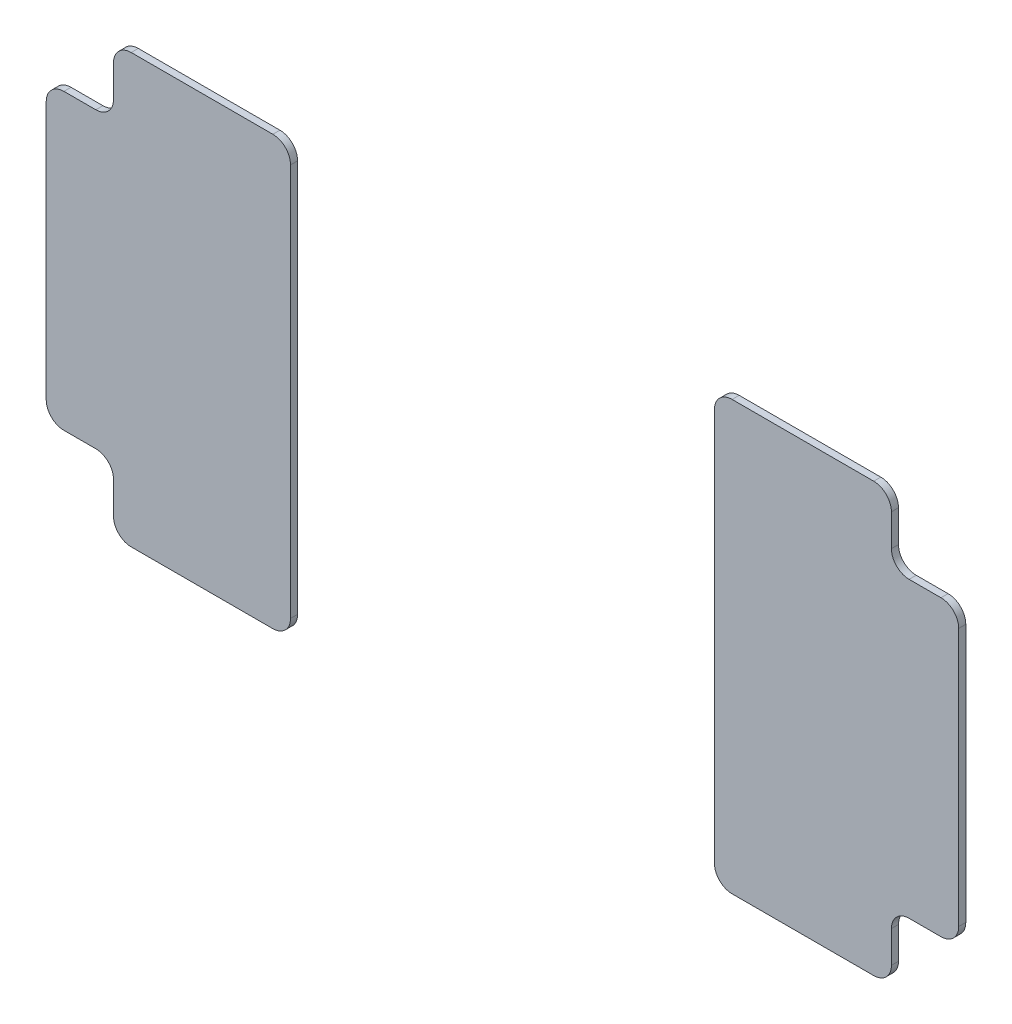
ISO-10303-21;
HEADER;
FILE_DESCRIPTION(('STEP AP214'),'2;1');
FILE_NAME('part.step','',(''),(''),'','','');
FILE_SCHEMA(('AUTOMOTIVE_DESIGN { 1 0 10303 214 1 1 1 1 }'));
ENDSEC;
DATA;
#1=APPLICATION_CONTEXT('core data for automotive mechanical design processes');
#2=APPLICATION_PROTOCOL_DEFINITION('international standard','automotive_design',2000,#1);
#3=PRODUCT_CONTEXT('',#1,'mechanical');
#4=PRODUCT('Part','Part','',(#3));
#5=PRODUCT_RELATED_PRODUCT_CATEGORY('part','',(#4));
#6=PRODUCT_DEFINITION_FORMATION('','',#4);
#7=PRODUCT_DEFINITION_CONTEXT('part definition',#1,'design');
#8=PRODUCT_DEFINITION('design','',#6,#7);
#9=PRODUCT_DEFINITION_SHAPE('','',#8);
#10=(LENGTH_UNIT() NAMED_UNIT(*) SI_UNIT(.MILLI.,.METRE.));
#11=(NAMED_UNIT(*) PLANE_ANGLE_UNIT() SI_UNIT($,.RADIAN.));
#12=(NAMED_UNIT(*) SI_UNIT($,.STERADIAN.) SOLID_ANGLE_UNIT());
#13=UNCERTAINTY_MEASURE_WITH_UNIT(LENGTH_MEASURE(1.E-05),#10,'distance_accuracy_value','');
#14=(GEOMETRIC_REPRESENTATION_CONTEXT(3) GLOBAL_UNCERTAINTY_ASSIGNED_CONTEXT((#13)) GLOBAL_UNIT_ASSIGNED_CONTEXT((#10,
#11,#12)) REPRESENTATION_CONTEXT('',''));
#15=CARTESIAN_POINT('',(0.,0.,0.));
#16=DIRECTION('',(0.,0.,1.));
#17=DIRECTION('',(1.,0.,0.));
#18=AXIS2_PLACEMENT_3D('',#15,#16,#17);
#19=CARTESIAN_POINT('',(0.,10.286374555593,-2.));
#20=DIRECTION('',(0.,-1.,0.));
#21=DIRECTION('',(0.,0.,-1.));
#22=AXIS2_PLACEMENT_3D('',#19,#20,#21);
#23=PLANE('',#22);
#24=DIRECTION('',(1.,0.,0.));
#25=VECTOR('',#24,1.);
#26=CARTESIAN_POINT('',(0.,10.286374555593,-2.));
#27=LINE('',#26,#25);
#28=CARTESIAN_POINT('',(205.158478801983,10.286374555593,-2.));
#29=VERTEX_POINT('',#28);
#30=CARTESIAN_POINT('',(245.158478801983,10.286374555593,-2.));
#31=VERTEX_POINT('',#30);
#32=EDGE_CURVE('E191',#29,#31,#27,.T.);
#33=ORIENTED_EDGE('',*,*,#32,.T.);
#34=DIRECTION('',(0.,0.,1.));
#35=VECTOR('',#34,1.);
#36=CARTESIAN_POINT('',(245.158478801983,10.286374555593,-2.));
#37=LINE('',#36,#35);
#38=CARTESIAN_POINT('',(245.158478801983,10.286374555593,0.));
#39=VERTEX_POINT('',#38);
#40=EDGE_CURVE('E250',#31,#39,#37,.T.);
#41=ORIENTED_EDGE('',*,*,#40,.T.);
#42=DIRECTION('',(1.,0.,0.));
#43=VECTOR('',#42,1.);
#44=CARTESIAN_POINT('',(0.,10.286374555593,0.));
#45=LINE('',#44,#43);
#46=CARTESIAN_POINT('',(205.158478801983,10.286374555593,0.));
#47=VERTEX_POINT('',#46);
#48=EDGE_CURVE('E295',#47,#39,#45,.T.);
#49=ORIENTED_EDGE('',*,*,#48,.F.);
#50=DIRECTION('',(0.,0.,1.));
#51=VECTOR('',#50,1.);
#52=CARTESIAN_POINT('',(205.158478801983,10.286374555593,-2.));
#53=LINE('',#52,#51);
#54=EDGE_CURVE('E248',#47,#29,#53,.F.);
#55=ORIENTED_EDGE('',*,*,#54,.T.);
#56=EDGE_LOOP('',(#33,#41,#49,#55));
#57=FACE_BOUND('',#56,.T.);
#58=ADVANCED_FACE('F49',(#57),#23,.T.);
#59=CARTESIAN_POINT('',(200.158478801983,0.,-2.));
#60=DIRECTION('',(1.,0.,0.));
#61=DIRECTION('',(0.,0.,-1.));
#62=AXIS2_PLACEMENT_3D('',#59,#60,#61);
#63=PLANE('',#62);
#64=DIRECTION('',(0.,1.,0.));
#65=VECTOR('',#64,1.);
#66=CARTESIAN_POINT('',(200.158478801983,0.,0.));
#67=LINE('',#66,#65);
#68=CARTESIAN_POINT('',(200.158478801983,15.286374555593,0.));
#69=VERTEX_POINT('',#68);
#70=CARTESIAN_POINT('',(200.158478801983,126.238694525702,0.));
#71=VERTEX_POINT('',#70);
#72=EDGE_CURVE('E188',#69,#71,#67,.T.);
#73=ORIENTED_EDGE('',*,*,#72,.T.);
#74=DIRECTION('',(0.,0.,1.));
#75=VECTOR('',#74,1.);
#76=CARTESIAN_POINT('',(200.158478801983,126.238694525702,-2.));
#77=LINE('',#76,#75);
#78=CARTESIAN_POINT('',(200.158478801983,126.238694525702,-2.));
#79=VERTEX_POINT('',#78);
#80=EDGE_CURVE('E167',#71,#79,#77,.F.);
#81=ORIENTED_EDGE('',*,*,#80,.T.);
#82=DIRECTION('',(0.,1.,0.));
#83=VECTOR('',#82,1.);
#84=CARTESIAN_POINT('',(200.158478801983,0.,-2.));
#85=LINE('',#84,#83);
#86=CARTESIAN_POINT('',(200.158478801983,15.286374555593,-2.));
#87=VERTEX_POINT('',#86);
#88=EDGE_CURVE('E199',#87,#79,#85,.T.);
#89=ORIENTED_EDGE('',*,*,#88,.F.);
#90=DIRECTION('',(0.,0.,1.));
#91=VECTOR('',#90,1.);
#92=CARTESIAN_POINT('',(200.158478801983,15.286374555593,0.));
#93=LINE('',#92,#91);
#94=EDGE_CURVE('E172',#87,#69,#93,.T.);
#95=ORIENTED_EDGE('',*,*,#94,.T.);
#96=EDGE_LOOP('',(#73,#81,#89,#95));
#97=FACE_BOUND('',#96,.T.);
#98=ADVANCED_FACE('F326',(#97),#63,.F.);
#99=CARTESIAN_POINT('',(0.,131.238694525702,-2.));
#100=DIRECTION('',(0.,-1.,0.));
#101=DIRECTION('',(0.,0.,-1.));
#102=AXIS2_PLACEMENT_3D('',#99,#100,#101);
#103=PLANE('',#102);
#104=DIRECTION('',(1.,0.,0.));
#105=VECTOR('',#104,1.);
#106=CARTESIAN_POINT('',(0.,131.238694525702,-2.));
#107=LINE('',#106,#105);
#108=CARTESIAN_POINT('',(205.158478801983,131.238694525702,-2.));
#109=VERTEX_POINT('',#108);
#110=CARTESIAN_POINT('',(245.158478801983,131.238694525702,-2.));
#111=VERTEX_POINT('',#110);
#112=EDGE_CURVE('E182',#109,#111,#107,.T.);
#113=ORIENTED_EDGE('',*,*,#112,.F.);
#114=DIRECTION('',(0.,0.,1.));
#115=VECTOR('',#114,1.);
#116=CARTESIAN_POINT('',(205.158478801983,131.238694525702,-2.));
#117=LINE('',#116,#115);
#118=CARTESIAN_POINT('',(205.158478801983,131.238694525702,0.));
#119=VERTEX_POINT('',#118);
#120=EDGE_CURVE('E166',#109,#119,#117,.T.);
#121=ORIENTED_EDGE('',*,*,#120,.T.);
#122=DIRECTION('',(1.,0.,0.));
#123=VECTOR('',#122,1.);
#124=CARTESIAN_POINT('',(0.,131.238694525702,0.));
#125=LINE('',#124,#123);
#126=CARTESIAN_POINT('',(245.158478801983,131.238694525702,0.));
#127=VERTEX_POINT('',#126);
#128=EDGE_CURVE('E179',#119,#127,#125,.T.);
#129=ORIENTED_EDGE('',*,*,#128,.T.);
#130=DIRECTION('',(0.,0.,1.));
#131=VECTOR('',#130,1.);
#132=CARTESIAN_POINT('',(245.158478801983,131.238694525702,-2.));
#133=LINE('',#132,#131);
#134=EDGE_CURVE('E184',#127,#111,#133,.F.);
#135=ORIENTED_EDGE('',*,*,#134,.T.);
#136=EDGE_LOOP('',(#113,#121,#129,#135));
#137=FACE_BOUND('',#136,.T.);
#138=ADVANCED_FACE('F178',(#137),#103,.F.);
#139=CARTESIAN_POINT('',(250.158478801983,0.,-2.));
#140=DIRECTION('',(1.,0.,0.));
#141=DIRECTION('',(0.,0.,-1.));
#142=AXIS2_PLACEMENT_3D('',#139,#140,#141);
#143=PLANE('',#142);
#144=DIRECTION('',(0.,1.,0.));
#145=VECTOR('',#144,1.);
#146=CARTESIAN_POINT('',(250.158478801983,0.,-2.));
#147=LINE('',#146,#145);
#148=CARTESIAN_POINT('',(250.158478801983,117.228286885617,-2.));
#149=VERTEX_POINT('',#148);
#150=CARTESIAN_POINT('',(250.158478801983,126.238694525702,-2.));
#151=VERTEX_POINT('',#150);
#152=EDGE_CURVE('E275',#149,#151,#147,.T.);
#153=ORIENTED_EDGE('',*,*,#152,.T.);
#154=DIRECTION('',(0.,0.,1.));
#155=VECTOR('',#154,1.);
#156=CARTESIAN_POINT('',(250.158478801983,126.238694525702,0.));
#157=LINE('',#156,#155);
#158=CARTESIAN_POINT('',(250.158478801983,126.238694525702,0.));
#159=VERTEX_POINT('',#158);
#160=EDGE_CURVE('E226',#151,#159,#157,.T.);
#161=ORIENTED_EDGE('',*,*,#160,.T.);
#162=DIRECTION('',(0.,1.,0.));
#163=VECTOR('',#162,1.);
#164=CARTESIAN_POINT('',(250.158478801983,0.,0.));
#165=LINE('',#164,#163);
#166=CARTESIAN_POINT('',(250.158478801983,117.228286885617,0.));
#167=VERTEX_POINT('',#166);
#168=EDGE_CURVE('E189',#167,#159,#165,.T.);
#169=ORIENTED_EDGE('',*,*,#168,.F.);
#170=DIRECTION('',(0.,0.,1.));
#171=VECTOR('',#170,1.);
#172=CARTESIAN_POINT('',(250.158478801983,117.228286885617,-2.));
#173=LINE('',#172,#171);
#174=EDGE_CURVE('E224',#167,#149,#173,.F.);
#175=ORIENTED_EDGE('',*,*,#174,.T.);
#176=EDGE_LOOP('',(#153,#161,#169,#175));
#177=FACE_BOUND('',#176,.T.);
#178=ADVANCED_FACE('F387',(#177),#143,.T.);
#179=CARTESIAN_POINT('',(0.,112.228286885617,-2.));
#180=DIRECTION('',(0.,-1.,0.));
#181=DIRECTION('',(1.,0.,0.));
#182=AXIS2_PLACEMENT_3D('',#179,#180,#181);
#183=PLANE('',#182);
#184=DIRECTION('',(1.,0.,0.));
#185=VECTOR('',#184,1.);
#186=CARTESIAN_POINT('',(0.,112.228286885617,-2.));
#187=LINE('',#186,#185);
#188=CARTESIAN_POINT('',(255.158478801983,112.228286885617,-2.));
#189=VERTEX_POINT('',#188);
#190=CARTESIAN_POINT('',(264.168886442069,112.228286885617,-2.));
#191=VERTEX_POINT('',#190);
#192=EDGE_CURVE('E281',#189,#191,#187,.T.);
#193=ORIENTED_EDGE('',*,*,#192,.F.);
#194=DIRECTION('',(0.,0.,1.));
#195=VECTOR('',#194,1.);
#196=CARTESIAN_POINT('',(255.158478801983,112.228286885617,-2.));
#197=LINE('',#196,#195);
#198=CARTESIAN_POINT('',(255.158478801983,112.228286885617,0.));
#199=VERTEX_POINT('',#198);
#200=EDGE_CURVE('E231',#189,#199,#197,.T.);
#201=ORIENTED_EDGE('',*,*,#200,.T.);
#202=DIRECTION('',(1.,0.,0.));
#203=VECTOR('',#202,1.);
#204=CARTESIAN_POINT('',(0.,112.228286885617,0.));
#205=LINE('',#204,#203);
#206=CARTESIAN_POINT('',(264.168886442069,112.228286885617,0.));
#207=VERTEX_POINT('',#206);
#208=EDGE_CURVE('E193',#199,#207,#205,.T.);
#209=ORIENTED_EDGE('',*,*,#208,.T.);
#210=DIRECTION('',(0.,0.,1.));
#211=VECTOR('',#210,1.);
#212=CARTESIAN_POINT('',(264.168886442069,112.228286885617,-2.));
#213=LINE('',#212,#211);
#214=EDGE_CURVE('E229',#207,#191,#213,.F.);
#215=ORIENTED_EDGE('',*,*,#214,.T.);
#216=EDGE_LOOP('',(#193,#201,#209,#215));
#217=FACE_BOUND('',#216,.T.);
#218=ADVANCED_FACE('F303',(#217),#183,.F.);
#219=CARTESIAN_POINT('',(269.168886442069,0.,-2.));
#220=DIRECTION('',(1.,0.,0.));
#221=DIRECTION('',(0.,0.,-1.));
#222=AXIS2_PLACEMENT_3D('',#219,#220,#221);
#223=PLANE('',#222);
#224=DIRECTION('',(0.,1.,0.));
#225=VECTOR('',#224,1.);
#226=CARTESIAN_POINT('',(269.168886442069,0.,-2.));
#227=LINE('',#226,#225);
#228=CARTESIAN_POINT('',(269.168886442069,34.2967821956785,-2.));
#229=VERTEX_POINT('',#228);
#230=CARTESIAN_POINT('',(269.168886442069,107.228286885617,-2.));
#231=VERTEX_POINT('',#230);
#232=EDGE_CURVE('E276',#229,#231,#227,.T.);
#233=ORIENTED_EDGE('',*,*,#232,.T.);
#234=DIRECTION('',(0.,0.,1.));
#235=VECTOR('',#234,1.);
#236=CARTESIAN_POINT('',(269.168886442069,107.228286885617,0.));
#237=LINE('',#236,#235);
#238=CARTESIAN_POINT('',(269.168886442069,107.228286885617,0.));
#239=VERTEX_POINT('',#238);
#240=EDGE_CURVE('E236',#231,#239,#237,.T.);
#241=ORIENTED_EDGE('',*,*,#240,.T.);
#242=DIRECTION('',(0.,1.,0.));
#243=VECTOR('',#242,1.);
#244=CARTESIAN_POINT('',(269.168886442069,0.,0.));
#245=LINE('',#244,#243);
#246=CARTESIAN_POINT('',(269.168886442069,34.2967821956785,0.));
#247=VERTEX_POINT('',#246);
#248=EDGE_CURVE('E267',#247,#239,#245,.T.);
#249=ORIENTED_EDGE('',*,*,#248,.F.);
#250=DIRECTION('',(0.,0.,1.));
#251=VECTOR('',#250,1.);
#252=CARTESIAN_POINT('',(269.168886442069,34.2967821956785,-2.));
#253=LINE('',#252,#251);
#254=EDGE_CURVE('E234',#247,#229,#253,.F.);
#255=ORIENTED_EDGE('',*,*,#254,.T.);
#256=EDGE_LOOP('',(#233,#241,#249,#255));
#257=FACE_BOUND('',#256,.T.);
#258=ADVANCED_FACE('F312',(#257),#223,.T.);
#259=CARTESIAN_POINT('',(0.,29.2967821956783,-2.));
#260=DIRECTION('',(0.,-1.,0.));
#261=DIRECTION('',(1.,0.,0.));
#262=AXIS2_PLACEMENT_3D('',#259,#260,#261);
#263=PLANE('',#262);
#264=DIRECTION('',(1.,0.,0.));
#265=VECTOR('',#264,1.);
#266=CARTESIAN_POINT('',(0.,29.2967821956783,0.));
#267=LINE('',#266,#265);
#268=CARTESIAN_POINT('',(255.158478801983,29.2967821956785,0.));
#269=VERTEX_POINT('',#268);
#270=CARTESIAN_POINT('',(264.168886442069,29.2967821956785,0.));
#271=VERTEX_POINT('',#270);
#272=EDGE_CURVE('E259',#269,#271,#267,.T.);
#273=ORIENTED_EDGE('',*,*,#272,.F.);
#274=DIRECTION('',(0.,0.,1.));
#275=VECTOR('',#274,1.);
#276=CARTESIAN_POINT('',(255.158478801983,29.2967821956785,-2.));
#277=LINE('',#276,#275);
#278=CARTESIAN_POINT('',(255.158478801983,29.2967821956785,-2.));
#279=VERTEX_POINT('',#278);
#280=EDGE_CURVE('E246',#269,#279,#277,.F.);
#281=ORIENTED_EDGE('',*,*,#280,.T.);
#282=DIRECTION('',(1.,0.,0.));
#283=VECTOR('',#282,1.);
#284=CARTESIAN_POINT('',(0.,29.2967821956783,-2.));
#285=LINE('',#284,#283);
#286=CARTESIAN_POINT('',(264.168886442069,29.2967821956785,-2.));
#287=VERTEX_POINT('',#286);
#288=EDGE_CURVE('E273',#279,#287,#285,.T.);
#289=ORIENTED_EDGE('',*,*,#288,.T.);
#290=DIRECTION('',(0.,0.,1.));
#291=VECTOR('',#290,1.);
#292=CARTESIAN_POINT('',(264.168886442069,29.2967821956785,-2.));
#293=LINE('',#292,#291);
#294=EDGE_CURVE('E243',#287,#271,#293,.T.);
#295=ORIENTED_EDGE('',*,*,#294,.T.);
#296=EDGE_LOOP('',(#273,#281,#289,#295));
#297=FACE_BOUND('',#296,.T.);
#298=ADVANCED_FACE('F264',(#297),#263,.T.);
#299=CARTESIAN_POINT('',(250.158478801983,15.286374555593,-2.));
#300=VERTEX_POINT('',#299);
#301=CARTESIAN_POINT('',(250.158478801983,24.2967821956785,-2.));
#302=VERTEX_POINT('',#301);
#303=EDGE_CURVE('E271',#300,#302,#147,.T.);
#304=ORIENTED_EDGE('',*,*,#303,.T.);
#305=DIRECTION('',(0.,0.,1.));
#306=VECTOR('',#305,1.);
#307=CARTESIAN_POINT('',(250.158478801983,24.2967821956785,0.));
#308=LINE('',#307,#306);
#309=CARTESIAN_POINT('',(250.158478801983,24.2967821956785,0.));
#310=VERTEX_POINT('',#309);
#311=EDGE_CURVE('E240',#302,#310,#308,.T.);
#312=ORIENTED_EDGE('',*,*,#311,.T.);
#313=CARTESIAN_POINT('',(250.158478801983,15.286374555593,0.));
#314=VERTEX_POINT('',#313);
#315=EDGE_CURVE('E195',#314,#310,#165,.T.);
#316=ORIENTED_EDGE('',*,*,#315,.F.);
#317=DIRECTION('',(0.,0.,1.));
#318=VECTOR('',#317,1.);
#319=CARTESIAN_POINT('',(250.158478801983,15.286374555593,-2.));
#320=LINE('',#319,#318);
#321=EDGE_CURVE('E69',#314,#300,#320,.F.);
#322=ORIENTED_EDGE('',*,*,#321,.T.);
#323=EDGE_LOOP('',(#304,#312,#316,#322));
#324=FACE_BOUND('',#323,.T.);
#325=ADVANCED_FACE('F270',(#324),#143,.T.);
#326=CARTESIAN_POINT('',(0.,0.,-2.));
#327=DIRECTION('',(0.,0.,1.));
#328=DIRECTION('',(1.,0.,0.));
#329=AXIS2_PLACEMENT_3D('',#326,#327,#328);
#330=PLANE('',#329);
#331=ORIENTED_EDGE('',*,*,#88,.T.);
#332=CARTESIAN_POINT('',(205.158478801983,126.238694525702,-2.));
#333=DIRECTION('',(0.,0.,1.));
#334=DIRECTION('',(1.,0.,0.));
#335=AXIS2_PLACEMENT_3D('',#332,#333,#334);
#336=CIRCLE('',#335,5.);
#337=EDGE_CURVE('E222',#79,#109,#336,.F.);
#338=ORIENTED_EDGE('',*,*,#337,.T.);
#339=ORIENTED_EDGE('',*,*,#112,.T.);
#340=CARTESIAN_POINT('',(245.158478801983,126.238694525702,-2.));
#341=DIRECTION('',(0.,0.,1.));
#342=DIRECTION('',(1.,0.,0.));
#343=AXIS2_PLACEMENT_3D('',#340,#341,#342);
#344=CIRCLE('',#343,5.);
#345=EDGE_CURVE('E220',#111,#151,#344,.F.);
#346=ORIENTED_EDGE('',*,*,#345,.T.);
#347=ORIENTED_EDGE('',*,*,#152,.F.);
#348=CARTESIAN_POINT('',(255.158478801983,117.228286885617,-2.));
#349=DIRECTION('',(0.,0.,1.));
#350=DIRECTION('',(1.,0.,0.));
#351=AXIS2_PLACEMENT_3D('',#348,#349,#350);
#352=CIRCLE('',#351,5.);
#353=EDGE_CURVE('E255',#149,#189,#352,.T.);
#354=ORIENTED_EDGE('',*,*,#353,.T.);
#355=ORIENTED_EDGE('',*,*,#192,.T.);
#356=CARTESIAN_POINT('',(264.168886442069,107.228286885617,-2.));
#357=DIRECTION('',(0.,0.,1.));
#358=DIRECTION('',(1.,0.,0.));
#359=AXIS2_PLACEMENT_3D('',#356,#357,#358);
#360=CIRCLE('',#359,5.);
#361=EDGE_CURVE('E218',#191,#231,#360,.F.);
#362=ORIENTED_EDGE('',*,*,#361,.T.);
#363=ORIENTED_EDGE('',*,*,#232,.F.);
#364=CARTESIAN_POINT('',(264.168886442069,34.2967821956785,-2.));
#365=DIRECTION('',(0.,0.,1.));
#366=DIRECTION('',(1.,0.,0.));
#367=AXIS2_PLACEMENT_3D('',#364,#365,#366);
#368=CIRCLE('',#367,5.);
#369=EDGE_CURVE('E216',#229,#287,#368,.F.);
#370=ORIENTED_EDGE('',*,*,#369,.T.);
#371=ORIENTED_EDGE('',*,*,#288,.F.);
#372=CARTESIAN_POINT('',(255.158478801983,24.2967821956785,-2.));
#373=DIRECTION('',(0.,0.,1.));
#374=DIRECTION('',(1.,0.,0.));
#375=AXIS2_PLACEMENT_3D('',#372,#373,#374);
#376=CIRCLE('',#375,5.);
#377=EDGE_CURVE('E12',#279,#302,#376,.T.);
#378=ORIENTED_EDGE('',*,*,#377,.T.);
#379=ORIENTED_EDGE('',*,*,#303,.F.);
#380=CARTESIAN_POINT('',(245.158478801983,15.286374555593,-2.));
#381=DIRECTION('',(0.,0.,1.));
#382=DIRECTION('',(1.,0.,0.));
#383=AXIS2_PLACEMENT_3D('',#380,#381,#382);
#384=CIRCLE('',#383,5.);
#385=EDGE_CURVE('E214',#300,#31,#384,.F.);
#386=ORIENTED_EDGE('',*,*,#385,.T.);
#387=ORIENTED_EDGE('',*,*,#32,.F.);
#388=CARTESIAN_POINT('',(205.158478801983,15.286374555593,-2.));
#389=DIRECTION('',(0.,0.,1.));
#390=DIRECTION('',(1.,0.,0.));
#391=AXIS2_PLACEMENT_3D('',#388,#389,#390);
#392=CIRCLE('',#391,5.);
#393=EDGE_CURVE('E212',#29,#87,#392,.F.);
#394=ORIENTED_EDGE('',*,*,#393,.T.);
#395=EDGE_LOOP('',(#331,#338,#339,#346,#347,#354,#355,#362,#363,#370,#371,#378,#379,#386,#387,#394));
#396=FACE_BOUND('',#395,.T.);
#397=ADVANCED_FACE('F309',(#396),#330,.F.);
#398=CARTESIAN_POINT('',(0.,0.,0.));
#399=DIRECTION('',(0.,0.,1.));
#400=DIRECTION('',(1.,0.,0.));
#401=AXIS2_PLACEMENT_3D('',#398,#399,#400);
#402=PLANE('',#401);
#403=ORIENTED_EDGE('',*,*,#128,.F.);
#404=CARTESIAN_POINT('',(205.158478801983,126.238694525702,0.));
#405=DIRECTION('',(0.,0.,1.));
#406=DIRECTION('',(1.,0.,0.));
#407=AXIS2_PLACEMENT_3D('',#404,#405,#406);
#408=CIRCLE('',#407,5.);
#409=EDGE_CURVE('E162',#119,#71,#408,.T.);
#410=ORIENTED_EDGE('',*,*,#409,.T.);
#411=ORIENTED_EDGE('',*,*,#72,.F.);
#412=CARTESIAN_POINT('',(205.158478801983,15.286374555593,0.));
#413=DIRECTION('',(0.,0.,1.));
#414=DIRECTION('',(1.,0.,0.));
#415=AXIS2_PLACEMENT_3D('',#412,#413,#414);
#416=CIRCLE('',#415,5.);
#417=EDGE_CURVE('E183',#69,#47,#416,.T.);
#418=ORIENTED_EDGE('',*,*,#417,.T.);
#419=ORIENTED_EDGE('',*,*,#48,.T.);
#420=CARTESIAN_POINT('',(245.158478801983,15.286374555593,0.));
#421=DIRECTION('',(0.,0.,1.));
#422=DIRECTION('',(1.,0.,0.));
#423=AXIS2_PLACEMENT_3D('',#420,#421,#422);
#424=CIRCLE('',#423,5.);
#425=EDGE_CURVE('E202',#39,#314,#424,.T.);
#426=ORIENTED_EDGE('',*,*,#425,.T.);
#427=ORIENTED_EDGE('',*,*,#315,.T.);
#428=CARTESIAN_POINT('',(255.158478801983,24.2967821956785,0.));
#429=DIRECTION('',(0.,0.,1.));
#430=DIRECTION('',(1.,0.,0.));
#431=AXIS2_PLACEMENT_3D('',#428,#429,#430);
#432=CIRCLE('',#431,5.);
#433=EDGE_CURVE('E57',#310,#269,#432,.F.);
#434=ORIENTED_EDGE('',*,*,#433,.T.);
#435=ORIENTED_EDGE('',*,*,#272,.T.);
#436=CARTESIAN_POINT('',(264.168886442069,34.2967821956785,0.));
#437=DIRECTION('',(0.,0.,1.));
#438=DIRECTION('',(1.,0.,0.));
#439=AXIS2_PLACEMENT_3D('',#436,#437,#438);
#440=CIRCLE('',#439,5.);
#441=EDGE_CURVE('E204',#271,#247,#440,.T.);
#442=ORIENTED_EDGE('',*,*,#441,.T.);
#443=ORIENTED_EDGE('',*,*,#248,.T.);
#444=CARTESIAN_POINT('',(264.168886442069,107.228286885617,0.));
#445=DIRECTION('',(0.,0.,1.));
#446=DIRECTION('',(1.,0.,0.));
#447=AXIS2_PLACEMENT_3D('',#444,#445,#446);
#448=CIRCLE('',#447,5.);
#449=EDGE_CURVE('E206',#239,#207,#448,.T.);
#450=ORIENTED_EDGE('',*,*,#449,.T.);
#451=ORIENTED_EDGE('',*,*,#208,.F.);
#452=CARTESIAN_POINT('',(255.158478801983,117.228286885617,0.));
#453=DIRECTION('',(0.,0.,1.));
#454=DIRECTION('',(1.,0.,0.));
#455=AXIS2_PLACEMENT_3D('',#452,#453,#454);
#456=CIRCLE('',#455,5.);
#457=EDGE_CURVE('E253',#199,#167,#456,.F.);
#458=ORIENTED_EDGE('',*,*,#457,.T.);
#459=ORIENTED_EDGE('',*,*,#168,.T.);
#460=CARTESIAN_POINT('',(245.158478801983,126.238694525702,0.));
#461=DIRECTION('',(0.,0.,1.));
#462=DIRECTION('',(1.,0.,0.));
#463=AXIS2_PLACEMENT_3D('',#460,#461,#462);
#464=CIRCLE('',#463,5.);
#465=EDGE_CURVE('E173',#159,#127,#464,.T.);
#466=ORIENTED_EDGE('',*,*,#465,.T.);
#467=EDGE_LOOP('',(#403,#410,#411,#418,#419,#426,#427,#434,#435,#442,#443,#450,#451,#458,#459,#466));
#468=FACE_BOUND('',#467,.T.);
#469=ADVANCED_FACE('F186',(#468),#402,.T.);
#470=CARTESIAN_POINT('',(205.158478801983,126.238694525702,-2.));
#471=DIRECTION('',(0.,0.,1.));
#472=DIRECTION('',(1.,0.,0.));
#473=AXIS2_PLACEMENT_3D('',#470,#471,#472);
#474=CYLINDRICAL_SURFACE('',#473,5.);
#475=ORIENTED_EDGE('',*,*,#337,.F.);
#476=ORIENTED_EDGE('',*,*,#80,.F.);
#477=ORIENTED_EDGE('',*,*,#409,.F.);
#478=ORIENTED_EDGE('',*,*,#120,.F.);
#479=EDGE_LOOP('',(#475,#476,#477,#478));
#480=FACE_BOUND('',#479,.T.);
#481=ADVANCED_FACE('F165',(#480),#474,.T.);
#482=CARTESIAN_POINT('',(245.158478801983,126.238694525702,-2.));
#483=DIRECTION('',(0.,0.,-1.));
#484=DIRECTION('',(-1.,0.,0.));
#485=AXIS2_PLACEMENT_3D('',#482,#483,#484);
#486=CYLINDRICAL_SURFACE('',#485,5.);
#487=ORIENTED_EDGE('',*,*,#345,.F.);
#488=ORIENTED_EDGE('',*,*,#134,.F.);
#489=ORIENTED_EDGE('',*,*,#465,.F.);
#490=ORIENTED_EDGE('',*,*,#160,.F.);
#491=EDGE_LOOP('',(#487,#488,#489,#490));
#492=FACE_BOUND('',#491,.T.);
#493=ADVANCED_FACE('F339',(#492),#486,.T.);
#494=CARTESIAN_POINT('',(255.158478801983,117.228286885617,-2.));
#495=DIRECTION('',(0.,0.,1.));
#496=DIRECTION('',(1.,0.,0.));
#497=AXIS2_PLACEMENT_3D('',#494,#495,#496);
#498=CYLINDRICAL_SURFACE('',#497,5.);
#499=ORIENTED_EDGE('',*,*,#353,.F.);
#500=ORIENTED_EDGE('',*,*,#174,.F.);
#501=ORIENTED_EDGE('',*,*,#457,.F.);
#502=ORIENTED_EDGE('',*,*,#200,.F.);
#503=EDGE_LOOP('',(#499,#500,#501,#502));
#504=FACE_BOUND('',#503,.T.);
#505=ADVANCED_FACE('F342',(#504),#498,.F.);
#506=CARTESIAN_POINT('',(264.168886442069,107.228286885617,-2.));
#507=DIRECTION('',(0.,0.,-1.));
#508=DIRECTION('',(-1.,0.,0.));
#509=AXIS2_PLACEMENT_3D('',#506,#507,#508);
#510=CYLINDRICAL_SURFACE('',#509,5.);
#511=ORIENTED_EDGE('',*,*,#361,.F.);
#512=ORIENTED_EDGE('',*,*,#214,.F.);
#513=ORIENTED_EDGE('',*,*,#449,.F.);
#514=ORIENTED_EDGE('',*,*,#240,.F.);
#515=EDGE_LOOP('',(#511,#512,#513,#514));
#516=FACE_BOUND('',#515,.T.);
#517=ADVANCED_FACE('F306',(#516),#510,.T.);
#518=CARTESIAN_POINT('',(255.158478801983,24.2967821956785,-2.));
#519=DIRECTION('',(0.,0.,-1.));
#520=DIRECTION('',(-1.,0.,0.));
#521=AXIS2_PLACEMENT_3D('',#518,#519,#520);
#522=CYLINDRICAL_SURFACE('',#521,5.);
#523=ORIENTED_EDGE('',*,*,#377,.F.);
#524=ORIENTED_EDGE('',*,*,#280,.F.);
#525=ORIENTED_EDGE('',*,*,#433,.F.);
#526=ORIENTED_EDGE('',*,*,#311,.F.);
#527=EDGE_LOOP('',(#523,#524,#525,#526));
#528=FACE_BOUND('',#527,.T.);
#529=ADVANCED_FACE('F269',(#528),#522,.F.);
#530=CARTESIAN_POINT('',(264.168886442069,34.2967821956785,-2.));
#531=DIRECTION('',(0.,0.,1.));
#532=DIRECTION('',(1.,0.,0.));
#533=AXIS2_PLACEMENT_3D('',#530,#531,#532);
#534=CYLINDRICAL_SURFACE('',#533,5.);
#535=ORIENTED_EDGE('',*,*,#369,.F.);
#536=ORIENTED_EDGE('',*,*,#254,.F.);
#537=ORIENTED_EDGE('',*,*,#441,.F.);
#538=ORIENTED_EDGE('',*,*,#294,.F.);
#539=EDGE_LOOP('',(#535,#536,#537,#538));
#540=FACE_BOUND('',#539,.T.);
#541=ADVANCED_FACE('F315',(#540),#534,.T.);
#542=CARTESIAN_POINT('',(245.158478801983,15.286374555593,-2.));
#543=DIRECTION('',(0.,0.,1.));
#544=DIRECTION('',(1.,0.,0.));
#545=AXIS2_PLACEMENT_3D('',#542,#543,#544);
#546=CYLINDRICAL_SURFACE('',#545,5.);
#547=ORIENTED_EDGE('',*,*,#385,.F.);
#548=ORIENTED_EDGE('',*,*,#321,.F.);
#549=ORIENTED_EDGE('',*,*,#425,.F.);
#550=ORIENTED_EDGE('',*,*,#40,.F.);
#551=EDGE_LOOP('',(#547,#548,#549,#550));
#552=FACE_BOUND('',#551,.T.);
#553=ADVANCED_FACE('F317',(#552),#546,.T.);
#554=CARTESIAN_POINT('',(205.158478801983,15.286374555593,-2.));
#555=DIRECTION('',(0.,0.,-1.));
#556=DIRECTION('',(-1.,0.,0.));
#557=AXIS2_PLACEMENT_3D('',#554,#555,#556);
#558=CYLINDRICAL_SURFACE('',#557,5.);
#559=ORIENTED_EDGE('',*,*,#393,.F.);
#560=ORIENTED_EDGE('',*,*,#54,.F.);
#561=ORIENTED_EDGE('',*,*,#417,.F.);
#562=ORIENTED_EDGE('',*,*,#94,.F.);
#563=EDGE_LOOP('',(#559,#560,#561,#562));
#564=FACE_BOUND('',#563,.T.);
#565=ADVANCED_FACE('F51',(#564),#558,.T.);
#566=CLOSED_SHELL('',(#58,#98,#138,#178,#218,#258,#298,#325,#397,#469,#481,#493,#505,#517,#529,
#541,#553,#565));
#567=MANIFOLD_SOLID_BREP('B2',#566);
#568=CARTESIAN_POINT('',(0.,112.228286885617,-2.));
#569=DIRECTION('',(0.,-1.,0.));
#570=DIRECTION('',(1.,0.,0.));
#571=AXIS2_PLACEMENT_3D('',#568,#569,#570);
#572=PLANE('',#571);
#573=DIRECTION('',(1.,0.,0.));
#574=VECTOR('',#573,1.);
#575=CARTESIAN_POINT('',(0.,112.228286885617,0.));
#576=LINE('',#575,#574);
#577=CARTESIAN_POINT('',(16.4118644100122,112.228286885617,0.));
#578=VERTEX_POINT('',#577);
#579=CARTESIAN_POINT('',(25.4222720500978,112.228286885617,0.));
#580=VERTEX_POINT('',#579);
#581=EDGE_CURVE('E639',#578,#580,#576,.T.);
#582=ORIENTED_EDGE('',*,*,#581,.T.);
#583=DIRECTION('',(0.,0.,1.));
#584=VECTOR('',#583,1.);
#585=CARTESIAN_POINT('',(25.4222720500978,112.228286885617,-2.));
#586=LINE('',#585,#584);
#587=CARTESIAN_POINT('',(25.4222720500978,112.228286885617,-2.));
#588=VERTEX_POINT('',#587);
#589=EDGE_CURVE('E742',#580,#588,#586,.F.);
#590=ORIENTED_EDGE('',*,*,#589,.T.);
#591=DIRECTION('',(1.,0.,0.));
#592=VECTOR('',#591,1.);
#593=CARTESIAN_POINT('',(0.,112.228286885617,-2.));
#594=LINE('',#593,#592);
#595=CARTESIAN_POINT('',(16.4118644100122,112.228286885617,-2.));
#596=VERTEX_POINT('',#595);
#597=EDGE_CURVE('E653',#596,#588,#594,.T.);
#598=ORIENTED_EDGE('',*,*,#597,.F.);
#599=DIRECTION('',(0.,0.,1.));
#600=VECTOR('',#599,1.);
#601=CARTESIAN_POINT('',(16.4118644100122,112.228286885617,-2.));
#602=LINE('',#601,#600);
#603=EDGE_CURVE('E738',#596,#578,#602,.T.);
#604=ORIENTED_EDGE('',*,*,#603,.T.);
#605=EDGE_LOOP('',(#582,#590,#598,#604));
#606=FACE_BOUND('',#605,.T.);
#607=ADVANCED_FACE('F494',(#606),#572,.F.);
#608=CARTESIAN_POINT('',(30.4222720500978,0.,-2.));
#609=DIRECTION('',(1.,0.,0.));
#610=DIRECTION('',(0.,0.,-1.));
#611=AXIS2_PLACEMENT_3D('',#608,#609,#610);
#612=PLANE('',#611);
#613=DIRECTION('',(0.,1.,0.));
#614=VECTOR('',#613,1.);
#615=CARTESIAN_POINT('',(30.4222720500978,0.,0.));
#616=LINE('',#615,#614);
#617=CARTESIAN_POINT('',(30.4222720500978,117.228286885617,0.));
#618=VERTEX_POINT('',#617);
#619=CARTESIAN_POINT('',(30.4222720500978,126.238694525702,0.));
#620=VERTEX_POINT('',#619);
#621=EDGE_CURVE('E649',#618,#620,#616,.T.);
#622=ORIENTED_EDGE('',*,*,#621,.T.);
#623=DIRECTION('',(0.,0.,1.));
#624=VECTOR('',#623,1.);
#625=CARTESIAN_POINT('',(30.4222720500978,126.238694525702,-2.));
#626=LINE('',#625,#624);
#627=CARTESIAN_POINT('',(30.4222720500978,126.238694525702,-2.));
#628=VERTEX_POINT('',#627);
#629=EDGE_CURVE('E735',#620,#628,#626,.F.);
#630=ORIENTED_EDGE('',*,*,#629,.T.);
#631=DIRECTION('',(0.,1.,0.));
#632=VECTOR('',#631,1.);
#633=CARTESIAN_POINT('',(30.4222720500978,0.,-2.));
#634=LINE('',#633,#632);
#635=CARTESIAN_POINT('',(30.4222720500978,117.228286885617,-2.));
#636=VERTEX_POINT('',#635);
#637=EDGE_CURVE('E667',#636,#628,#634,.T.);
#638=ORIENTED_EDGE('',*,*,#637,.F.);
#639=DIRECTION('',(0.,0.,1.));
#640=VECTOR('',#639,1.);
#641=CARTESIAN_POINT('',(30.4222720500978,117.228286885617,0.));
#642=LINE('',#641,#640);
#643=EDGE_CURVE('E731',#636,#618,#642,.T.);
#644=ORIENTED_EDGE('',*,*,#643,.T.);
#645=EDGE_LOOP('',(#622,#630,#638,#644));
#646=FACE_BOUND('',#645,.T.);
#647=ADVANCED_FACE('F767',(#646),#612,.F.);
#648=CARTESIAN_POINT('',(0.,131.238694525702,-2.));
#649=DIRECTION('',(0.,-1.,0.));
#650=DIRECTION('',(0.,0.,-1.));
#651=AXIS2_PLACEMENT_3D('',#648,#649,#650);
#652=PLANE('',#651);
#653=DIRECTION('',(1.,0.,0.));
#654=VECTOR('',#653,1.);
#655=CARTESIAN_POINT('',(0.,131.238694525702,0.));
#656=LINE('',#655,#654);
#657=CARTESIAN_POINT('',(35.4222720500978,131.238694525702,0.));
#658=VERTEX_POINT('',#657);
#659=CARTESIAN_POINT('',(75.4222720500978,131.238694525702,0.));
#660=VERTEX_POINT('',#659);
#661=EDGE_CURVE('E654',#658,#660,#656,.T.);
#662=ORIENTED_EDGE('',*,*,#661,.T.);
#663=DIRECTION('',(0.,0.,1.));
#664=VECTOR('',#663,1.);
#665=CARTESIAN_POINT('',(75.4222720500978,131.238694525702,-2.));
#666=LINE('',#665,#664);
#667=CARTESIAN_POINT('',(75.4222720500978,131.238694525702,-2.));
#668=VERTEX_POINT('',#667);
#669=EDGE_CURVE('E728',#660,#668,#666,.F.);
#670=ORIENTED_EDGE('',*,*,#669,.T.);
#671=DIRECTION('',(1.,0.,0.));
#672=VECTOR('',#671,1.);
#673=CARTESIAN_POINT('',(0.,131.238694525702,-2.));
#674=LINE('',#673,#672);
#675=CARTESIAN_POINT('',(35.4222720500978,131.238694525702,-2.));
#676=VERTEX_POINT('',#675);
#677=EDGE_CURVE('E770',#676,#668,#674,.T.);
#678=ORIENTED_EDGE('',*,*,#677,.F.);
#679=DIRECTION('',(0.,0.,1.));
#680=VECTOR('',#679,1.);
#681=CARTESIAN_POINT('',(35.4222720500978,131.238694525702,-2.));
#682=LINE('',#681,#680);
#683=EDGE_CURVE('E724',#676,#658,#682,.T.);
#684=ORIENTED_EDGE('',*,*,#683,.T.);
#685=EDGE_LOOP('',(#662,#670,#678,#684));
#686=FACE_BOUND('',#685,.T.);
#687=ADVANCED_FACE('F810',(#686),#652,.F.);
#688=CARTESIAN_POINT('',(80.4222720500978,0.,-2.));
#689=DIRECTION('',(1.,0.,0.));
#690=DIRECTION('',(0.,0.,-1.));
#691=AXIS2_PLACEMENT_3D('',#688,#689,#690);
#692=PLANE('',#691);
#693=DIRECTION('',(0.,1.,0.));
#694=VECTOR('',#693,1.);
#695=CARTESIAN_POINT('',(80.4222720500978,0.,0.));
#696=LINE('',#695,#694);
#697=CARTESIAN_POINT('',(80.4222720500978,15.286374555593,0.));
#698=VERTEX_POINT('',#697);
#699=CARTESIAN_POINT('',(80.4222720500978,126.238694525702,0.));
#700=VERTEX_POINT('',#699);
#701=EDGE_CURVE('E659',#698,#700,#696,.T.);
#702=ORIENTED_EDGE('',*,*,#701,.F.);
#703=DIRECTION('',(0.,0.,1.));
#704=VECTOR('',#703,1.);
#705=CARTESIAN_POINT('',(80.4222720500978,15.286374555593,-2.));
#706=LINE('',#705,#704);
#707=CARTESIAN_POINT('',(80.4222720500978,15.286374555593,-2.));
#708=VERTEX_POINT('',#707);
#709=EDGE_CURVE('E721',#698,#708,#706,.F.);
#710=ORIENTED_EDGE('',*,*,#709,.T.);
#711=DIRECTION('',(0.,1.,0.));
#712=VECTOR('',#711,1.);
#713=CARTESIAN_POINT('',(80.4222720500978,0.,-2.));
#714=LINE('',#713,#712);
#715=CARTESIAN_POINT('',(80.4222720500978,126.238694525702,-2.));
#716=VERTEX_POINT('',#715);
#717=EDGE_CURVE('E775',#708,#716,#714,.T.);
#718=ORIENTED_EDGE('',*,*,#717,.T.);
#719=DIRECTION('',(0.,0.,1.));
#720=VECTOR('',#719,1.);
#721=CARTESIAN_POINT('',(80.4222720500978,126.238694525702,0.));
#722=LINE('',#721,#720);
#723=EDGE_CURVE('E717',#716,#700,#722,.T.);
#724=ORIENTED_EDGE('',*,*,#723,.T.);
#725=EDGE_LOOP('',(#702,#710,#718,#724));
#726=FACE_BOUND('',#725,.T.);
#727=ADVANCED_FACE('F847',(#726),#692,.T.);
#728=CARTESIAN_POINT('',(0.,10.2863745555929,-2.));
#729=DIRECTION('',(0.,-1.,0.));
#730=DIRECTION('',(1.,0.,0.));
#731=AXIS2_PLACEMENT_3D('',#728,#729,#730);
#732=PLANE('',#731);
#733=DIRECTION('',(1.,0.,0.));
#734=VECTOR('',#733,1.);
#735=CARTESIAN_POINT('',(0.,10.2863745555929,0.));
#736=LINE('',#735,#734);
#737=CARTESIAN_POINT('',(35.4222720500978,10.2863745555929,0.));
#738=VERTEX_POINT('',#737);
#739=CARTESIAN_POINT('',(75.4222720500978,10.286374555593,0.));
#740=VERTEX_POINT('',#739);
#741=EDGE_CURVE('E655',#738,#740,#736,.T.);
#742=ORIENTED_EDGE('',*,*,#741,.F.);
#743=DIRECTION('',(0.,0.,1.));
#744=VECTOR('',#743,1.);
#745=CARTESIAN_POINT('',(35.4222720500978,10.2863745555929,-2.));
#746=LINE('',#745,#744);
#747=CARTESIAN_POINT('',(35.4222720500978,10.2863745555929,-2.));
#748=VERTEX_POINT('',#747);
#749=EDGE_CURVE('E714',#738,#748,#746,.F.);
#750=ORIENTED_EDGE('',*,*,#749,.T.);
#751=DIRECTION('',(1.,0.,0.));
#752=VECTOR('',#751,1.);
#753=CARTESIAN_POINT('',(0.,10.2863745555929,-2.));
#754=LINE('',#753,#752);
#755=CARTESIAN_POINT('',(75.4222720500978,10.286374555593,-2.));
#756=VERTEX_POINT('',#755);
#757=EDGE_CURVE('E779',#748,#756,#754,.T.);
#758=ORIENTED_EDGE('',*,*,#757,.T.);
#759=DIRECTION('',(0.,0.,1.));
#760=VECTOR('',#759,1.);
#761=CARTESIAN_POINT('',(75.4222720500978,10.286374555593,-2.));
#762=LINE('',#761,#760);
#763=EDGE_CURVE('E710',#756,#740,#762,.T.);
#764=ORIENTED_EDGE('',*,*,#763,.T.);
#765=EDGE_LOOP('',(#742,#750,#758,#764));
#766=FACE_BOUND('',#765,.T.);
#767=ADVANCED_FACE('F854',(#766),#732,.T.);
#768=CARTESIAN_POINT('',(30.4222720500978,15.2863745555929,0.));
#769=VERTEX_POINT('',#768);
#770=CARTESIAN_POINT('',(30.4222720500978,24.2967821956785,0.));
#771=VERTEX_POINT('',#770);
#772=EDGE_CURVE('E643',#769,#771,#616,.T.);
#773=ORIENTED_EDGE('',*,*,#772,.T.);
#774=DIRECTION('',(0.,0.,1.));
#775=VECTOR('',#774,1.);
#776=CARTESIAN_POINT('',(30.4222720500978,24.2967821956785,-2.));
#777=LINE('',#776,#775);
#778=CARTESIAN_POINT('',(30.4222720500978,24.2967821956785,-2.));
#779=VERTEX_POINT('',#778);
#780=EDGE_CURVE('E510',#771,#779,#777,.F.);
#781=ORIENTED_EDGE('',*,*,#780,.T.);
#782=CARTESIAN_POINT('',(30.4222720500978,15.2863745555929,-2.));
#783=VERTEX_POINT('',#782);
#784=EDGE_CURVE('E772',#783,#779,#634,.T.);
#785=ORIENTED_EDGE('',*,*,#784,.F.);
#786=DIRECTION('',(0.,0.,1.));
#787=VECTOR('',#786,1.);
#788=CARTESIAN_POINT('',(30.4222720500978,15.2863745555929,0.));
#789=LINE('',#788,#787);
#790=EDGE_CURVE('E704',#783,#769,#789,.T.);
#791=ORIENTED_EDGE('',*,*,#790,.T.);
#792=EDGE_LOOP('',(#773,#781,#785,#791));
#793=FACE_BOUND('',#792,.T.);
#794=ADVANCED_FACE('F794',(#793),#612,.F.);
#795=CARTESIAN_POINT('',(0.,29.2967821956785,-2.));
#796=DIRECTION('',(0.,-1.,0.));
#797=DIRECTION('',(1.,0.,0.));
#798=AXIS2_PLACEMENT_3D('',#795,#796,#797);
#799=PLANE('',#798);
#800=DIRECTION('',(1.,0.,0.));
#801=VECTOR('',#800,1.);
#802=CARTESIAN_POINT('',(0.,29.2967821956785,0.));
#803=LINE('',#802,#801);
#804=CARTESIAN_POINT('',(16.4118644100122,29.2967821956785,0.));
#805=VERTEX_POINT('',#804);
#806=CARTESIAN_POINT('',(25.4222720500978,29.2967821956785,0.));
#807=VERTEX_POINT('',#806);
#808=EDGE_CURVE('E638',#805,#807,#803,.T.);
#809=ORIENTED_EDGE('',*,*,#808,.F.);
#810=DIRECTION('',(0.,0.,1.));
#811=VECTOR('',#810,1.);
#812=CARTESIAN_POINT('',(16.4118644100122,29.2967821956785,-2.));
#813=LINE('',#812,#811);
#814=CARTESIAN_POINT('',(16.4118644100122,29.2967821956785,-2.));
#815=VERTEX_POINT('',#814);
#816=EDGE_CURVE('E614',#805,#815,#813,.F.);
#817=ORIENTED_EDGE('',*,*,#816,.T.);
#818=DIRECTION('',(1.,0.,0.));
#819=VECTOR('',#818,1.);
#820=CARTESIAN_POINT('',(0.,29.2967821956785,-2.));
#821=LINE('',#820,#819);
#822=CARTESIAN_POINT('',(25.4222720500978,29.2967821956785,-2.));
#823=VERTEX_POINT('',#822);
#824=EDGE_CURVE('E780',#815,#823,#821,.T.);
#825=ORIENTED_EDGE('',*,*,#824,.T.);
#826=DIRECTION('',(0.,0.,1.));
#827=VECTOR('',#826,1.);
#828=CARTESIAN_POINT('',(25.4222720500978,29.2967821956785,-2.));
#829=LINE('',#828,#827);
#830=EDGE_CURVE('E620',#823,#807,#829,.T.);
#831=ORIENTED_EDGE('',*,*,#830,.T.);
#832=EDGE_LOOP('',(#809,#817,#825,#831));
#833=FACE_BOUND('',#832,.T.);
#834=ADVANCED_FACE('F862',(#833),#799,.T.);
#835=CARTESIAN_POINT('',(11.4118644100122,0.,-2.));
#836=DIRECTION('',(1.,0.,0.));
#837=DIRECTION('',(0.,0.,-1.));
#838=AXIS2_PLACEMENT_3D('',#835,#836,#837);
#839=PLANE('',#838);
#840=DIRECTION('',(0.,1.,0.));
#841=VECTOR('',#840,1.);
#842=CARTESIAN_POINT('',(11.4118644100122,0.,-2.));
#843=LINE('',#842,#841);
#844=CARTESIAN_POINT('',(11.4118644100122,34.2967821956785,-2.));
#845=VERTEX_POINT('',#844);
#846=CARTESIAN_POINT('',(11.4118644100122,107.228286885617,-2.));
#847=VERTEX_POINT('',#846);
#848=EDGE_CURVE('E630',#845,#847,#843,.T.);
#849=ORIENTED_EDGE('',*,*,#848,.F.);
#850=DIRECTION('',(0.,0.,1.));
#851=VECTOR('',#850,1.);
#852=CARTESIAN_POINT('',(11.4118644100122,34.2967821956785,0.));
#853=LINE('',#852,#851);
#854=CARTESIAN_POINT('',(11.4118644100122,34.2967821956785,0.));
#855=VERTEX_POINT('',#854);
#856=EDGE_CURVE('E613',#845,#855,#853,.T.);
#857=ORIENTED_EDGE('',*,*,#856,.T.);
#858=DIRECTION('',(0.,1.,0.));
#859=VECTOR('',#858,1.);
#860=CARTESIAN_POINT('',(11.4118644100122,0.,0.));
#861=LINE('',#860,#859);
#862=CARTESIAN_POINT('',(11.4118644100122,107.228286885617,0.));
#863=VERTEX_POINT('',#862);
#864=EDGE_CURVE('E627',#855,#863,#861,.T.);
#865=ORIENTED_EDGE('',*,*,#864,.T.);
#866=DIRECTION('',(0.,0.,1.));
#867=VECTOR('',#866,1.);
#868=CARTESIAN_POINT('',(11.4118644100122,107.228286885617,-2.));
#869=LINE('',#868,#867);
#870=EDGE_CURVE('E633',#863,#847,#869,.F.);
#871=ORIENTED_EDGE('',*,*,#870,.T.);
#872=EDGE_LOOP('',(#849,#857,#865,#871));
#873=FACE_BOUND('',#872,.T.);
#874=ADVANCED_FACE('F626',(#873),#839,.F.);
#875=CARTESIAN_POINT('',(0.,0.,-2.));
#876=DIRECTION('',(0.,0.,1.));
#877=DIRECTION('',(1.,0.,0.));
#878=AXIS2_PLACEMENT_3D('',#875,#876,#877);
#879=PLANE('',#878);
#880=ORIENTED_EDGE('',*,*,#824,.F.);
#881=CARTESIAN_POINT('',(16.4118644100122,34.2967821956785,-2.));
#882=DIRECTION('',(0.,0.,1.));
#883=DIRECTION('',(1.,0.,0.));
#884=AXIS2_PLACEMENT_3D('',#881,#882,#883);
#885=CIRCLE('',#884,5.);
#886=EDGE_CURVE('E701',#815,#845,#885,.F.);
#887=ORIENTED_EDGE('',*,*,#886,.T.);
#888=ORIENTED_EDGE('',*,*,#848,.T.);
#889=CARTESIAN_POINT('',(16.4118644100122,107.228286885617,-2.));
#890=DIRECTION('',(0.,0.,1.));
#891=DIRECTION('',(1.,0.,0.));
#892=AXIS2_PLACEMENT_3D('',#889,#890,#891);
#893=CIRCLE('',#892,5.);
#894=EDGE_CURVE('E687',#847,#596,#893,.F.);
#895=ORIENTED_EDGE('',*,*,#894,.T.);
#896=ORIENTED_EDGE('',*,*,#597,.T.);
#897=CARTESIAN_POINT('',(25.4222720500978,117.228286885617,-2.));
#898=DIRECTION('',(0.,0.,1.));
#899=DIRECTION('',(1.,0.,0.));
#900=AXIS2_PLACEMENT_3D('',#897,#898,#899);
#901=CIRCLE('',#900,5.);
#902=EDGE_CURVE('E47',#588,#636,#901,.T.);
#903=ORIENTED_EDGE('',*,*,#902,.T.);
#904=ORIENTED_EDGE('',*,*,#637,.T.);
#905=CARTESIAN_POINT('',(35.4222720500978,126.238694525702,-2.));
#906=DIRECTION('',(0.,0.,1.));
#907=DIRECTION('',(1.,0.,0.));
#908=AXIS2_PLACEMENT_3D('',#905,#906,#907);
#909=CIRCLE('',#908,5.);
#910=EDGE_CURVE('E690',#628,#676,#909,.F.);
#911=ORIENTED_EDGE('',*,*,#910,.T.);
#912=ORIENTED_EDGE('',*,*,#677,.T.);
#913=CARTESIAN_POINT('',(75.4222720500978,126.238694525702,-2.));
#914=DIRECTION('',(0.,0.,1.));
#915=DIRECTION('',(1.,0.,0.));
#916=AXIS2_PLACEMENT_3D('',#913,#914,#915);
#917=CIRCLE('',#916,5.);
#918=EDGE_CURVE('E693',#668,#716,#917,.F.);
#919=ORIENTED_EDGE('',*,*,#918,.T.);
#920=ORIENTED_EDGE('',*,*,#717,.F.);
#921=CARTESIAN_POINT('',(75.4222720500978,15.286374555593,-2.));
#922=DIRECTION('',(0.,0.,1.));
#923=DIRECTION('',(1.,0.,0.));
#924=AXIS2_PLACEMENT_3D('',#921,#922,#923);
#925=CIRCLE('',#924,5.);
#926=EDGE_CURVE('E696',#708,#756,#925,.F.);
#927=ORIENTED_EDGE('',*,*,#926,.T.);
#928=ORIENTED_EDGE('',*,*,#757,.F.);
#929=CARTESIAN_POINT('',(35.4222720500978,15.2863745555929,-2.));
#930=DIRECTION('',(0.,0.,1.));
#931=DIRECTION('',(1.,0.,0.));
#932=AXIS2_PLACEMENT_3D('',#929,#930,#931);
#933=CIRCLE('',#932,5.);
#934=EDGE_CURVE('E517',#748,#783,#933,.F.);
#935=ORIENTED_EDGE('',*,*,#934,.T.);
#936=ORIENTED_EDGE('',*,*,#784,.T.);
#937=CARTESIAN_POINT('',(25.4222720500978,24.2967821956785,-2.));
#938=DIRECTION('',(0.,0.,1.));
#939=DIRECTION('',(1.,0.,0.));
#940=AXIS2_PLACEMENT_3D('',#937,#938,#939);
#941=CIRCLE('',#940,5.);
#942=EDGE_CURVE('E748',#779,#823,#941,.T.);
#943=ORIENTED_EDGE('',*,*,#942,.T.);
#944=EDGE_LOOP('',(#880,#887,#888,#895,#896,#903,#904,#911,#912,#919,#920,#927,#928,#935,#936,#943));
#945=FACE_BOUND('',#944,.T.);
#946=ADVANCED_FACE('F764',(#945),#879,.F.);
#947=CARTESIAN_POINT('',(0.,0.,0.));
#948=DIRECTION('',(0.,0.,1.));
#949=DIRECTION('',(1.,0.,0.));
#950=AXIS2_PLACEMENT_3D('',#947,#948,#949);
#951=PLANE('',#950);
#952=ORIENTED_EDGE('',*,*,#864,.F.);
#953=CARTESIAN_POINT('',(16.4118644100122,34.2967821956785,0.));
#954=DIRECTION('',(0.,0.,1.));
#955=DIRECTION('',(1.,0.,0.));
#956=AXIS2_PLACEMENT_3D('',#953,#954,#955);
#957=CIRCLE('',#956,5.);
#958=EDGE_CURVE('E609',#855,#805,#957,.T.);
#959=ORIENTED_EDGE('',*,*,#958,.T.);
#960=ORIENTED_EDGE('',*,*,#808,.T.);
#961=CARTESIAN_POINT('',(25.4222720500978,24.2967821956785,0.));
#962=DIRECTION('',(0.,0.,1.));
#963=DIRECTION('',(1.,0.,0.));
#964=AXIS2_PLACEMENT_3D('',#961,#962,#963);
#965=CIRCLE('',#964,5.);
#966=EDGE_CURVE('E745',#807,#771,#965,.F.);
#967=ORIENTED_EDGE('',*,*,#966,.T.);
#968=ORIENTED_EDGE('',*,*,#772,.F.);
#969=CARTESIAN_POINT('',(35.4222720500978,15.2863745555929,0.));
#970=DIRECTION('',(0.,0.,1.));
#971=DIRECTION('',(1.,0.,0.));
#972=AXIS2_PLACEMENT_3D('',#969,#970,#971);
#973=CIRCLE('',#972,5.);
#974=EDGE_CURVE('E621',#769,#738,#973,.T.);
#975=ORIENTED_EDGE('',*,*,#974,.T.);
#976=ORIENTED_EDGE('',*,*,#741,.T.);
#977=CARTESIAN_POINT('',(75.4222720500978,15.286374555593,0.));
#978=DIRECTION('',(0.,0.,1.));
#979=DIRECTION('',(1.,0.,0.));
#980=AXIS2_PLACEMENT_3D('',#977,#978,#979);
#981=CIRCLE('',#980,5.);
#982=EDGE_CURVE('E677',#740,#698,#981,.T.);
#983=ORIENTED_EDGE('',*,*,#982,.T.);
#984=ORIENTED_EDGE('',*,*,#701,.T.);
#985=CARTESIAN_POINT('',(75.4222720500978,126.238694525702,0.));
#986=DIRECTION('',(0.,0.,1.));
#987=DIRECTION('',(1.,0.,0.));
#988=AXIS2_PLACEMENT_3D('',#985,#986,#987);
#989=CIRCLE('',#988,5.);
#990=EDGE_CURVE('E674',#700,#660,#989,.T.);
#991=ORIENTED_EDGE('',*,*,#990,.T.);
#992=ORIENTED_EDGE('',*,*,#661,.F.);
#993=CARTESIAN_POINT('',(35.4222720500978,126.238694525702,0.));
#994=DIRECTION('',(0.,0.,1.));
#995=DIRECTION('',(1.,0.,0.));
#996=AXIS2_PLACEMENT_3D('',#993,#994,#995);
#997=CIRCLE('',#996,5.);
#998=EDGE_CURVE('E671',#658,#620,#997,.T.);
#999=ORIENTED_EDGE('',*,*,#998,.T.);
#1000=ORIENTED_EDGE('',*,*,#621,.F.);
#1001=CARTESIAN_POINT('',(25.4222720500978,117.228286885617,0.));
#1002=DIRECTION('',(0.,0.,1.));
#1003=DIRECTION('',(1.,0.,0.));
#1004=AXIS2_PLACEMENT_3D('',#1001,#1002,#1003);
#1005=CIRCLE('',#1004,5.);
#1006=EDGE_CURVE('E503',#618,#580,#1005,.F.);
#1007=ORIENTED_EDGE('',*,*,#1006,.T.);
#1008=ORIENTED_EDGE('',*,*,#581,.F.);
#1009=CARTESIAN_POINT('',(16.4118644100122,107.228286885617,0.));
#1010=DIRECTION('',(0.,0.,1.));
#1011=DIRECTION('',(1.,0.,0.));
#1012=AXIS2_PLACEMENT_3D('',#1009,#1010,#1011);
#1013=CIRCLE('',#1012,5.);
#1014=EDGE_CURVE('E632',#578,#863,#1013,.T.);
#1015=ORIENTED_EDGE('',*,*,#1014,.T.);
#1016=EDGE_LOOP('',(#952,#959,#960,#967,#968,#975,#976,#983,#984,#991,#992,#999,#1000,#1007,
#1008,#1015));
#1017=FACE_BOUND('',#1016,.T.);
#1018=ADVANCED_FACE('F635',(#1017),#951,.T.);
#1019=CARTESIAN_POINT('',(16.4118644100122,34.2967821956785,-2.));
#1020=DIRECTION('',(0.,0.,-1.));
#1021=DIRECTION('',(-1.,0.,0.));
#1022=AXIS2_PLACEMENT_3D('',#1019,#1020,#1021);
#1023=CYLINDRICAL_SURFACE('',#1022,5.);
#1024=ORIENTED_EDGE('',*,*,#886,.F.);
#1025=ORIENTED_EDGE('',*,*,#816,.F.);
#1026=ORIENTED_EDGE('',*,*,#958,.F.);
#1027=ORIENTED_EDGE('',*,*,#856,.F.);
#1028=EDGE_LOOP('',(#1024,#1025,#1026,#1027));
#1029=FACE_BOUND('',#1028,.T.);
#1030=ADVANCED_FACE('F612',(#1029),#1023,.T.);
#1031=CARTESIAN_POINT('',(25.4222720500978,24.2967821956785,-2.));
#1032=DIRECTION('',(0.,0.,1.));
#1033=DIRECTION('',(1.,0.,0.));
#1034=AXIS2_PLACEMENT_3D('',#1031,#1032,#1033);
#1035=CYLINDRICAL_SURFACE('',#1034,5.);
#1036=ORIENTED_EDGE('',*,*,#942,.F.);
#1037=ORIENTED_EDGE('',*,*,#780,.F.);
#1038=ORIENTED_EDGE('',*,*,#966,.F.);
#1039=ORIENTED_EDGE('',*,*,#830,.F.);
#1040=EDGE_LOOP('',(#1036,#1037,#1038,#1039));
#1041=FACE_BOUND('',#1040,.T.);
#1042=ADVANCED_FACE('F797',(#1041),#1035,.F.);
#1043=CARTESIAN_POINT('',(35.4222720500978,15.2863745555929,-2.));
#1044=DIRECTION('',(0.,0.,-1.));
#1045=DIRECTION('',(-1.,0.,0.));
#1046=AXIS2_PLACEMENT_3D('',#1043,#1044,#1045);
#1047=CYLINDRICAL_SURFACE('',#1046,5.);
#1048=ORIENTED_EDGE('',*,*,#934,.F.);
#1049=ORIENTED_EDGE('',*,*,#749,.F.);
#1050=ORIENTED_EDGE('',*,*,#974,.F.);
#1051=ORIENTED_EDGE('',*,*,#790,.F.);
#1052=EDGE_LOOP('',(#1048,#1049,#1050,#1051));
#1053=FACE_BOUND('',#1052,.T.);
#1054=ADVANCED_FACE('F819',(#1053),#1047,.T.);
#1055=CARTESIAN_POINT('',(75.4222720500978,15.286374555593,-2.));
#1056=DIRECTION('',(0.,0.,1.));
#1057=DIRECTION('',(1.,0.,0.));
#1058=AXIS2_PLACEMENT_3D('',#1055,#1056,#1057);
#1059=CYLINDRICAL_SURFACE('',#1058,5.);
#1060=ORIENTED_EDGE('',*,*,#926,.F.);
#1061=ORIENTED_EDGE('',*,*,#709,.F.);
#1062=ORIENTED_EDGE('',*,*,#982,.F.);
#1063=ORIENTED_EDGE('',*,*,#763,.F.);
#1064=EDGE_LOOP('',(#1060,#1061,#1062,#1063));
#1065=FACE_BOUND('',#1064,.T.);
#1066=ADVANCED_FACE('F822',(#1065),#1059,.T.);
#1067=CARTESIAN_POINT('',(75.4222720500978,126.238694525702,-2.));
#1068=DIRECTION('',(0.,0.,-1.));
#1069=DIRECTION('',(-1.,0.,0.));
#1070=AXIS2_PLACEMENT_3D('',#1067,#1068,#1069);
#1071=CYLINDRICAL_SURFACE('',#1070,5.);
#1072=ORIENTED_EDGE('',*,*,#918,.F.);
#1073=ORIENTED_EDGE('',*,*,#669,.F.);
#1074=ORIENTED_EDGE('',*,*,#990,.F.);
#1075=ORIENTED_EDGE('',*,*,#723,.F.);
#1076=EDGE_LOOP('',(#1072,#1073,#1074,#1075));
#1077=FACE_BOUND('',#1076,.T.);
#1078=ADVANCED_FACE('F826',(#1077),#1071,.T.);
#1079=CARTESIAN_POINT('',(35.4222720500978,126.238694525702,-2.));
#1080=DIRECTION('',(0.,0.,1.));
#1081=DIRECTION('',(1.,0.,0.));
#1082=AXIS2_PLACEMENT_3D('',#1079,#1080,#1081);
#1083=CYLINDRICAL_SURFACE('',#1082,5.);
#1084=ORIENTED_EDGE('',*,*,#910,.F.);
#1085=ORIENTED_EDGE('',*,*,#629,.F.);
#1086=ORIENTED_EDGE('',*,*,#998,.F.);
#1087=ORIENTED_EDGE('',*,*,#683,.F.);
#1088=EDGE_LOOP('',(#1084,#1085,#1086,#1087));
#1089=FACE_BOUND('',#1088,.T.);
#1090=ADVANCED_FACE('F804',(#1089),#1083,.T.);
#1091=CARTESIAN_POINT('',(25.4222720500978,117.228286885617,-2.));
#1092=DIRECTION('',(0.,0.,-1.));
#1093=DIRECTION('',(-1.,0.,0.));
#1094=AXIS2_PLACEMENT_3D('',#1091,#1092,#1093);
#1095=CYLINDRICAL_SURFACE('',#1094,5.);
#1096=ORIENTED_EDGE('',*,*,#902,.F.);
#1097=ORIENTED_EDGE('',*,*,#589,.F.);
#1098=ORIENTED_EDGE('',*,*,#1006,.F.);
#1099=ORIENTED_EDGE('',*,*,#643,.F.);
#1100=EDGE_LOOP('',(#1096,#1097,#1098,#1099));
#1101=FACE_BOUND('',#1100,.T.);
#1102=ADVANCED_FACE('F760',(#1101),#1095,.F.);
#1103=CARTESIAN_POINT('',(16.4118644100122,107.228286885617,-2.));
#1104=DIRECTION('',(0.,0.,1.));
#1105=DIRECTION('',(1.,0.,0.));
#1106=AXIS2_PLACEMENT_3D('',#1103,#1104,#1105);
#1107=CYLINDRICAL_SURFACE('',#1106,5.);
#1108=ORIENTED_EDGE('',*,*,#894,.F.);
#1109=ORIENTED_EDGE('',*,*,#870,.F.);
#1110=ORIENTED_EDGE('',*,*,#1014,.F.);
#1111=ORIENTED_EDGE('',*,*,#603,.F.);
#1112=EDGE_LOOP('',(#1108,#1109,#1110,#1111));
#1113=FACE_BOUND('',#1112,.T.);
#1114=ADVANCED_FACE('F496',(#1113),#1107,.T.);
#1115=CLOSED_SHELL('',(#607,#647,#687,#727,#767,#794,#834,#874,#946,#1018,#1030,#1042,#1054,
#1066,#1078,#1090,#1102,#1114));
#1116=MANIFOLD_SOLID_BREP('B6',#1115);
#1117=ADVANCED_BREP_SHAPE_REPRESENTATION('',(#18,#567,#1116),#14);
#1118=SHAPE_DEFINITION_REPRESENTATION(#9,#1117);
ENDSEC;
END-ISO-10303-21;
